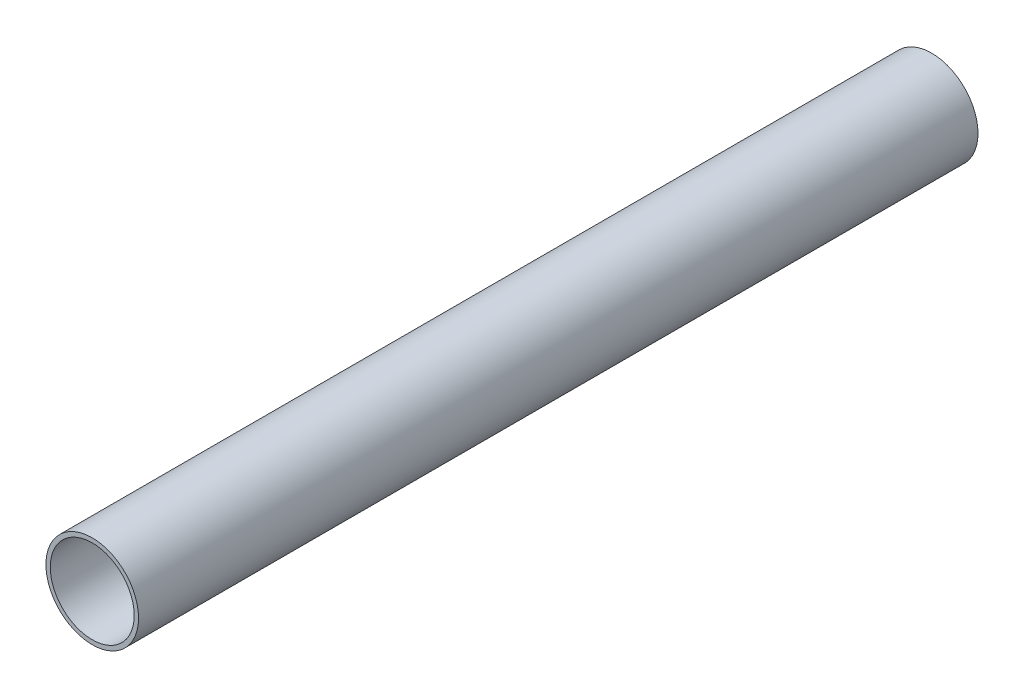
ISO-10303-21;
HEADER;
FILE_DESCRIPTION(('STEP AP214'),'2;1');
FILE_NAME('part.step','',(''),(''),'','','');
FILE_SCHEMA(('AUTOMOTIVE_DESIGN { 1 0 10303 214 1 1 1 1 }'));
ENDSEC;
DATA;
#1=APPLICATION_CONTEXT('core data for automotive mechanical design processes');
#2=APPLICATION_PROTOCOL_DEFINITION('international standard','automotive_design',2000,#1);
#3=PRODUCT_CONTEXT('',#1,'mechanical');
#4=PRODUCT('Part','Part','',(#3));
#5=PRODUCT_RELATED_PRODUCT_CATEGORY('part','',(#4));
#6=PRODUCT_DEFINITION_FORMATION('','',#4);
#7=PRODUCT_DEFINITION_CONTEXT('part definition',#1,'design');
#8=PRODUCT_DEFINITION('design','',#6,#7);
#9=PRODUCT_DEFINITION_SHAPE('','',#8);
#10=(LENGTH_UNIT() NAMED_UNIT(*) SI_UNIT(.MILLI.,.METRE.));
#11=(NAMED_UNIT(*) PLANE_ANGLE_UNIT() SI_UNIT($,.RADIAN.));
#12=(NAMED_UNIT(*) SI_UNIT($,.STERADIAN.) SOLID_ANGLE_UNIT());
#13=UNCERTAINTY_MEASURE_WITH_UNIT(LENGTH_MEASURE(1.E-05),#10,'distance_accuracy_value','');
#14=(GEOMETRIC_REPRESENTATION_CONTEXT(3) GLOBAL_UNCERTAINTY_ASSIGNED_CONTEXT((#13)) GLOBAL_UNIT_ASSIGNED_CONTEXT((#10,
#11,#12)) REPRESENTATION_CONTEXT('',''));
#15=CARTESIAN_POINT('',(0.,0.,0.));
#16=DIRECTION('',(0.,0.,1.));
#17=DIRECTION('',(1.,0.,0.));
#18=AXIS2_PLACEMENT_3D('',#15,#16,#17);
#19=CARTESIAN_POINT('',(0.,0.,-145.));
#20=DIRECTION('',(0.,0.,1.));
#21=DIRECTION('',(1.,0.,0.));
#22=AXIS2_PLACEMENT_3D('',#19,#20,#21);
#23=CYLINDRICAL_SURFACE('',#22,8.);
#24=CARTESIAN_POINT('',(0.,0.,-145.));
#25=DIRECTION('',(0.,0.,1.));
#26=DIRECTION('',(1.,0.,0.));
#27=AXIS2_PLACEMENT_3D('',#24,#25,#26);
#28=CIRCLE('',#27,8.);
#29=CARTESIAN_POINT('',(8.,0.,-145.));
#30=VERTEX_POINT('',#29);
#31=EDGE_CURVE('E10',#30,#30,#28,.T.);
#32=ORIENTED_EDGE('',*,*,#31,.T.);
#33=EDGE_LOOP('',(#32));
#34=FACE_BOUND('',#33,.T.);
#35=CARTESIAN_POINT('',(0.,0.,0.));
#36=DIRECTION('',(0.,0.,1.));
#37=DIRECTION('',(1.,0.,0.));
#38=AXIS2_PLACEMENT_3D('',#35,#36,#37);
#39=CIRCLE('',#38,8.);
#40=CARTESIAN_POINT('',(8.,0.,0.));
#41=VERTEX_POINT('',#40);
#42=EDGE_CURVE('E31',#41,#41,#39,.T.);
#43=ORIENTED_EDGE('',*,*,#42,.F.);
#44=EDGE_LOOP('',(#43));
#45=FACE_BOUND('',#44,.T.);
#46=ADVANCED_FACE('F28',(#34,#45),#23,.T.);
#47=CARTESIAN_POINT('',(0.,0.,-145.));
#48=DIRECTION('',(0.,0.,1.));
#49=DIRECTION('',(1.,0.,0.));
#50=AXIS2_PLACEMENT_3D('',#47,#48,#49);
#51=PLANE('',#50);
#52=CARTESIAN_POINT('',(0.,0.,-145.));
#53=DIRECTION('',(0.,0.,1.));
#54=DIRECTION('',(1.,0.,0.));
#55=AXIS2_PLACEMENT_3D('',#52,#53,#54);
#56=CIRCLE('',#55,7.25);
#57=CARTESIAN_POINT('',(7.25,0.,-145.));
#58=VERTEX_POINT('',#57);
#59=EDGE_CURVE('E38',#58,#58,#56,.T.);
#60=ORIENTED_EDGE('',*,*,#59,.T.);
#61=EDGE_LOOP('',(#60));
#62=FACE_BOUND('',#61,.T.);
#63=ORIENTED_EDGE('',*,*,#31,.F.);
#64=EDGE_LOOP('',(#63));
#65=FACE_BOUND('',#64,.T.);
#66=ADVANCED_FACE('F46',(#62,#65),#51,.F.);
#67=CARTESIAN_POINT('',(0.,0.,0.));
#68=DIRECTION('',(0.,0.,1.));
#69=DIRECTION('',(1.,0.,0.));
#70=AXIS2_PLACEMENT_3D('',#67,#68,#69);
#71=PLANE('',#70);
#72=CARTESIAN_POINT('',(0.,0.,0.));
#73=DIRECTION('',(0.,0.,1.));
#74=DIRECTION('',(1.,0.,0.));
#75=AXIS2_PLACEMENT_3D('',#72,#73,#74);
#76=CIRCLE('',#75,7.25);
#77=CARTESIAN_POINT('',(7.25,0.,0.));
#78=VERTEX_POINT('',#77);
#79=EDGE_CURVE('E40',#78,#78,#76,.T.);
#80=ORIENTED_EDGE('',*,*,#79,.F.);
#81=EDGE_LOOP('',(#80));
#82=FACE_BOUND('',#81,.T.);
#83=ORIENTED_EDGE('',*,*,#42,.T.);
#84=EDGE_LOOP('',(#83));
#85=FACE_BOUND('',#84,.T.);
#86=ADVANCED_FACE('F52',(#82,#85),#71,.T.);
#87=CARTESIAN_POINT('',(0.,0.,-145.));
#88=DIRECTION('',(0.,0.,1.));
#89=DIRECTION('',(1.,0.,0.));
#90=AXIS2_PLACEMENT_3D('',#87,#88,#89);
#91=CYLINDRICAL_SURFACE('',#90,7.25);
#92=ORIENTED_EDGE('',*,*,#59,.F.);
#93=EDGE_LOOP('',(#92));
#94=FACE_BOUND('',#93,.T.);
#95=ORIENTED_EDGE('',*,*,#79,.T.);
#96=EDGE_LOOP('',(#95));
#97=FACE_BOUND('',#96,.T.);
#98=ADVANCED_FACE('F49',(#94,#97),#91,.F.);
#99=CLOSED_SHELL('',(#46,#66,#86,#98));
#100=MANIFOLD_SOLID_BREP('B2',#99);
#101=ADVANCED_BREP_SHAPE_REPRESENTATION('',(#18,#100),#14);
#102=SHAPE_DEFINITION_REPRESENTATION(#9,#101);
ENDSEC;
END-ISO-10303-21;
